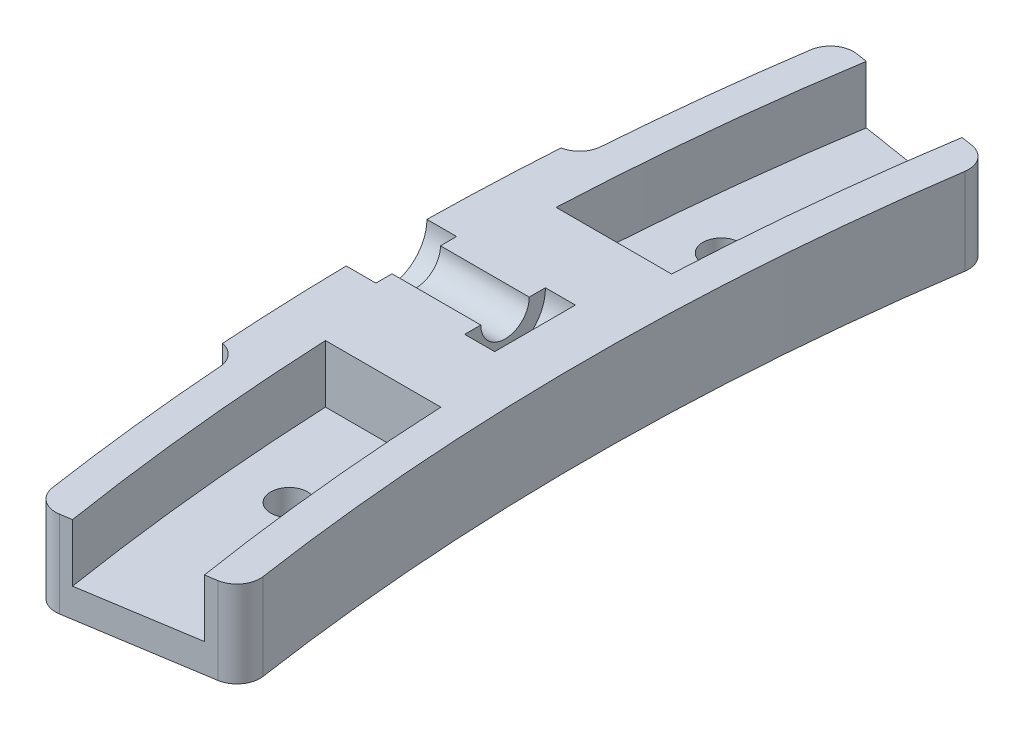
ISO-10303-21;
HEADER;
FILE_DESCRIPTION(('STEP AP214'),'2;1');
FILE_NAME('part.step','',(''),(''),'','','');
FILE_SCHEMA(('AUTOMOTIVE_DESIGN { 1 0 10303 214 1 1 1 1 }'));
ENDSEC;
DATA;
#1=APPLICATION_CONTEXT('core data for automotive mechanical design processes');
#2=APPLICATION_PROTOCOL_DEFINITION('international standard','automotive_design',2000,#1);
#3=PRODUCT_CONTEXT('',#1,'mechanical');
#4=PRODUCT('Part','Part','',(#3));
#5=PRODUCT_RELATED_PRODUCT_CATEGORY('part','',(#4));
#6=PRODUCT_DEFINITION_FORMATION('','',#4);
#7=PRODUCT_DEFINITION_CONTEXT('part definition',#1,'design');
#8=PRODUCT_DEFINITION('design','',#6,#7);
#9=PRODUCT_DEFINITION_SHAPE('','',#8);
#10=(LENGTH_UNIT() NAMED_UNIT(*) SI_UNIT(.MILLI.,.METRE.));
#11=(NAMED_UNIT(*) PLANE_ANGLE_UNIT() SI_UNIT($,.RADIAN.));
#12=(NAMED_UNIT(*) SI_UNIT($,.STERADIAN.) SOLID_ANGLE_UNIT());
#13=UNCERTAINTY_MEASURE_WITH_UNIT(LENGTH_MEASURE(1.E-05),#10,'distance_accuracy_value','');
#14=(GEOMETRIC_REPRESENTATION_CONTEXT(3) GLOBAL_UNCERTAINTY_ASSIGNED_CONTEXT((#13)) GLOBAL_UNIT_ASSIGNED_CONTEXT((#10,
#11,#12)) REPRESENTATION_CONTEXT('',''));
#15=CARTESIAN_POINT('',(0.,0.,0.));
#16=DIRECTION('',(0.,0.,1.));
#17=DIRECTION('',(1.,0.,0.));
#18=AXIS2_PLACEMENT_3D('',#15,#16,#17);
#19=CARTESIAN_POINT('',(0.,7.5,0.));
#20=DIRECTION('',(0.,1.,0.));
#21=DIRECTION('',(0.,0.,1.));
#22=AXIS2_PLACEMENT_3D('',#19,#20,#21);
#23=PLANE('',#22);
#24=CARTESIAN_POINT('',(0.,7.5,0.));
#25=DIRECTION('',(0.,1.,0.));
#26=DIRECTION('',(0.,0.,1.));
#27=AXIS2_PLACEMENT_3D('',#24,#25,#26);
#28=CIRCLE('',#27,224.5);
#29=CARTESIAN_POINT('',(-224.019328267066,7.5,-14.6830025121671));
#30=VERTEX_POINT('',#29);
#31=CARTESIAN_POINT('',(-224.472715491215,7.5,-3.5));
#32=VERTEX_POINT('',#31);
#33=EDGE_CURVE('E319',#30,#32,#28,.T.);
#34=ORIENTED_EDGE('',*,*,#33,.T.);
#35=DIRECTION('',(-1.,0.,0.));
#36=VECTOR('',#35,1.);
#37=CARTESIAN_POINT('',(-224.5,7.5,-3.5));
#38=LINE('',#37,#36);
#39=CARTESIAN_POINT('',(-221.9,7.5,-3.5));
#40=VERTEX_POINT('',#39);
#41=EDGE_CURVE('E222',#32,#40,#38,.F.);
#42=ORIENTED_EDGE('',*,*,#41,.T.);
#43=DIRECTION('',(0.,0.,1.));
#44=VECTOR('',#43,1.);
#45=CARTESIAN_POINT('',(-221.9,7.5,0.));
#46=LINE('',#45,#44);
#47=CARTESIAN_POINT('',(-221.9,7.5,-2.10000000000001));
#48=VERTEX_POINT('',#47);
#49=EDGE_CURVE('E223',#40,#48,#46,.T.);
#50=ORIENTED_EDGE('',*,*,#49,.T.);
#51=DIRECTION('',(1.,0.,0.));
#52=VECTOR('',#51,1.);
#53=CARTESIAN_POINT('',(-224.5,7.5,-2.10000000000001));
#54=LINE('',#53,#52);
#55=CARTESIAN_POINT('',(-214.200000000001,7.5,-2.10000000000001));
#56=VERTEX_POINT('',#55);
#57=EDGE_CURVE('E244',#56,#48,#54,.F.);
#58=ORIENTED_EDGE('',*,*,#57,.F.);
#59=DIRECTION('',(0.,0.,1.));
#60=VECTOR('',#59,1.);
#61=CARTESIAN_POINT('',(-214.2,7.5,5.26399215997816E-12));
#62=LINE('',#61,#60);
#63=CARTESIAN_POINT('',(-214.200000000001,7.5,-3.49947186729268));
#64=VERTEX_POINT('',#63);
#65=EDGE_CURVE('E243',#64,#56,#62,.T.);
#66=ORIENTED_EDGE('',*,*,#65,.F.);
#67=DIRECTION('',(1.,0.,0.));
#68=VECTOR('',#67,1.);
#69=CARTESIAN_POINT('',(-214.200000000001,7.5,-3.49947186729268));
#70=LINE('',#69,#68);
#71=CARTESIAN_POINT('',(-211.600000000001,7.5,-3.49947186729274));
#72=VERTEX_POINT('',#71);
#73=EDGE_CURVE('E414',#64,#72,#70,.T.);
#74=ORIENTED_EDGE('',*,*,#73,.T.);
#75=DIRECTION('',(0.,0.,1.));
#76=VECTOR('',#75,1.);
#77=CARTESIAN_POINT('',(-211.6,7.5,5.20009683030522E-12));
#78=LINE('',#77,#76);
#79=CARTESIAN_POINT('',(-211.6,7.5,3.49947186730315));
#80=VERTEX_POINT('',#79);
#81=EDGE_CURVE('E406',#72,#80,#78,.T.);
#82=ORIENTED_EDGE('',*,*,#81,.T.);
#83=DIRECTION('',(1.,0.,0.));
#84=VECTOR('',#83,1.);
#85=CARTESIAN_POINT('',(-214.2,7.5,3.49947186730321));
#86=LINE('',#85,#84);
#87=CARTESIAN_POINT('',(-214.2,7.5,3.49947186730321));
#88=VERTEX_POINT('',#87);
#89=EDGE_CURVE('E411',#80,#88,#86,.F.);
#90=ORIENTED_EDGE('',*,*,#89,.T.);
#91=CARTESIAN_POINT('',(-214.2,7.5,2.09999999999999));
#92=VERTEX_POINT('',#91);
#93=EDGE_CURVE('E239',#92,#88,#62,.T.);
#94=ORIENTED_EDGE('',*,*,#93,.F.);
#95=DIRECTION('',(1.,0.,0.));
#96=VECTOR('',#95,1.);
#97=CARTESIAN_POINT('',(-224.5,7.5,2.09999999999999));
#98=LINE('',#97,#96);
#99=CARTESIAN_POINT('',(-221.9,7.5,2.09999999999999));
#100=VERTEX_POINT('',#99);
#101=EDGE_CURVE('E231',#100,#92,#98,.T.);
#102=ORIENTED_EDGE('',*,*,#101,.F.);
#103=CARTESIAN_POINT('',(-221.9,7.5,3.49999999999995));
#104=VERTEX_POINT('',#103);
#105=EDGE_CURVE('E58',#100,#104,#46,.T.);
#106=ORIENTED_EDGE('',*,*,#105,.T.);
#107=DIRECTION('',(-1.,0.,0.));
#108=VECTOR('',#107,1.);
#109=CARTESIAN_POINT('',(-224.5,7.5,3.49999999999995));
#110=LINE('',#109,#108);
#111=CARTESIAN_POINT('',(-224.472715491215,7.5,3.49999999999995));
#112=VERTEX_POINT('',#111);
#113=EDGE_CURVE('E216',#104,#112,#110,.T.);
#114=ORIENTED_EDGE('',*,*,#113,.T.);
#115=CARTESIAN_POINT('',(-224.019328267066,7.5,14.6830025121672));
#116=VERTEX_POINT('',#115);
#117=EDGE_CURVE('E322',#112,#116,#28,.T.);
#118=ORIENTED_EDGE('',*,*,#117,.T.);
#119=CARTESIAN_POINT('',(-224.383131319015,7.5,16.6496360162551));
#120=DIRECTION('',(0.,1.,0.));
#121=DIRECTION('',(0.,0.,1.));
#122=AXIS2_PLACEMENT_3D('',#119,#120,#121);
#123=CIRCLE('',#122,2.);
#124=CARTESIAN_POINT('',(-222.388614596179,7.5,16.5016392516661));
#125=VERTEX_POINT('',#124);
#126=EDGE_CURVE('E66',#116,#125,#123,.F.);
#127=ORIENTED_EDGE('',*,*,#126,.T.);
#128=CARTESIAN_POINT('',(0.,7.5,0.));
#129=DIRECTION('',(0.,1.,0.));
#130=DIRECTION('',(0.,0.,1.));
#131=AXIS2_PLACEMENT_3D('',#128,#129,#130);
#132=CIRCLE('',#131,223.);
#133=CARTESIAN_POINT('',(-220.561180845032,7.5,32.8902037732362));
#134=VERTEX_POINT('',#133);
#135=EDGE_CURVE('E340',#125,#134,#132,.T.);
#136=ORIENTED_EDGE('',*,*,#135,.T.);
#137=CARTESIAN_POINT('',(-218.583053662566,7.5,32.5952243671982));
#138=DIRECTION('',(0.,1.,0.));
#139=DIRECTION('',(0.,0.,1.));
#140=AXIS2_PLACEMENT_3D('',#137,#138,#139);
#141=CIRCLE('',#140,2.);
#142=CARTESIAN_POINT('',(-218.270184732485,7.5,34.5706010483885));
#143=VERTEX_POINT('',#142);
#144=EDGE_CURVE('E373',#134,#143,#141,.T.);
#145=ORIENTED_EDGE('',*,*,#144,.T.);
#146=DIRECTION('',(-0.987688340595137,0.,0.156434465040234));
#147=VECTOR('',#146,1.);
#148=CARTESIAN_POINT('',(0.,7.5,0.));
#149=LINE('',#148,#147);
#150=CARTESIAN_POINT('',(-217.29143493093,7.5,34.4155823088514));
#151=VERTEX_POINT('',#150);
#152=EDGE_CURVE('E334',#151,#143,#149,.T.);
#153=ORIENTED_EDGE('',*,*,#152,.F.);
#154=CARTESIAN_POINT('',(0.,7.5,0.));
#155=DIRECTION('',(0.,1.,0.));
#156=DIRECTION('',(0.,0.,1.));
#157=AXIS2_PLACEMENT_3D('',#154,#155,#156);
#158=CIRCLE('',#157,220.);
#159=CARTESIAN_POINT('',(-219.772609758359,7.5,10.));
#160=VERTEX_POINT('',#159);
#161=EDGE_CURVE('E306',#160,#151,#158,.T.);
#162=ORIENTED_EDGE('',*,*,#161,.F.);
#163=DIRECTION('',(-1.,0.,0.));
#164=VECTOR('',#163,1.);
#165=CARTESIAN_POINT('',(0.,7.5,10.));
#166=LINE('',#165,#164);
#167=CARTESIAN_POINT('',(-209.76176963403,7.5,10.));
#168=VERTEX_POINT('',#167);
#169=EDGE_CURVE('E260',#168,#160,#166,.T.);
#170=ORIENTED_EDGE('',*,*,#169,.F.);
#171=CARTESIAN_POINT('',(0.,7.5,0.));
#172=DIRECTION('',(0.,1.,0.));
#173=DIRECTION('',(0.,0.,1.));
#174=AXIS2_PLACEMENT_3D('',#171,#172,#173);
#175=CIRCLE('',#174,210.);
#176=CARTESIAN_POINT('',(-207.414551524979,7.5,32.8512376584491));
#177=VERTEX_POINT('',#176);
#178=EDGE_CURVE('E296',#168,#177,#175,.T.);
#179=ORIENTED_EDGE('',*,*,#178,.T.);
#180=CARTESIAN_POINT('',(-206.417411404929,7.5,32.6933061786099));
#181=VERTEX_POINT('',#180);
#182=EDGE_CURVE('E331',#181,#177,#149,.T.);
#183=ORIENTED_EDGE('',*,*,#182,.F.);
#184=CARTESIAN_POINT('',(-206.730280335009,7.5,30.7179294974196));
#185=DIRECTION('',(0.,1.,0.));
#186=DIRECTION('',(0.,0.,1.));
#187=AXIS2_PLACEMENT_3D('',#184,#185,#186);
#188=CIRCLE('',#187,2.);
#189=CARTESIAN_POINT('',(-204.752000140416,7.5,30.4239780189754));
#190=VERTEX_POINT('',#189);
#191=EDGE_CURVE('E375',#181,#190,#188,.T.);
#192=ORIENTED_EDGE('',*,*,#191,.T.);
#193=CARTESIAN_POINT('',(0.,7.5,0.));
#194=DIRECTION('',(0.,1.,0.));
#195=DIRECTION('',(0.,0.,1.));
#196=AXIS2_PLACEMENT_3D('',#193,#194,#195);
#197=CIRCLE('',#196,207.);
#198=CARTESIAN_POINT('',(-204.752000140416,7.5,-30.4239780189754));
#199=VERTEX_POINT('',#198);
#200=EDGE_CURVE('E333',#199,#190,#197,.T.);
#201=ORIENTED_EDGE('',*,*,#200,.F.);
#202=CARTESIAN_POINT('',(-206.730280335009,7.5,-30.7179294974196));
#203=DIRECTION('',(0.,1.,0.));
#204=DIRECTION('',(0.,0.,1.));
#205=AXIS2_PLACEMENT_3D('',#202,#203,#204);
#206=CIRCLE('',#205,2.);
#207=CARTESIAN_POINT('',(-206.417411404929,7.5,-32.6933061786099));
#208=VERTEX_POINT('',#207);
#209=EDGE_CURVE('E377',#199,#208,#206,.T.);
#210=ORIENTED_EDGE('',*,*,#209,.T.);
#211=DIRECTION('',(0.987688340595137,0.,0.156434465040234));
#212=VECTOR('',#211,1.);
#213=CARTESIAN_POINT('',(0.,7.5,0.));
#214=LINE('',#213,#212);
#215=CARTESIAN_POINT('',(-207.414551524979,7.5,-32.8512376584492));
#216=VERTEX_POINT('',#215);
#217=EDGE_CURVE('E337',#216,#208,#214,.T.);
#218=ORIENTED_EDGE('',*,*,#217,.F.);
#219=CARTESIAN_POINT('',(0.,7.5,0.));
#220=DIRECTION('',(0.,1.,0.));
#221=DIRECTION('',(0.,0.,1.));
#222=AXIS2_PLACEMENT_3D('',#219,#220,#221);
#223=CIRCLE('',#222,210.);
#224=CARTESIAN_POINT('',(-209.76176963403,7.5,-9.99999999999998));
#225=VERTEX_POINT('',#224);
#226=EDGE_CURVE('E265',#216,#225,#223,.T.);
#227=ORIENTED_EDGE('',*,*,#226,.T.);
#228=DIRECTION('',(-1.,0.,0.));
#229=VECTOR('',#228,1.);
#230=CARTESIAN_POINT('',(0.,7.5,-10.));
#231=LINE('',#230,#229);
#232=CARTESIAN_POINT('',(-219.772609758359,7.5,-9.99999999999997));
#233=VERTEX_POINT('',#232);
#234=EDGE_CURVE('E276',#225,#233,#231,.T.);
#235=ORIENTED_EDGE('',*,*,#234,.T.);
#236=CARTESIAN_POINT('',(0.,7.5,0.));
#237=DIRECTION('',(0.,1.,0.));
#238=DIRECTION('',(0.,0.,1.));
#239=AXIS2_PLACEMENT_3D('',#236,#237,#238);
#240=CIRCLE('',#239,220.);
#241=CARTESIAN_POINT('',(-217.29143493093,7.5,-34.4155823088514));
#242=VERTEX_POINT('',#241);
#243=EDGE_CURVE('E273',#242,#233,#240,.T.);
#244=ORIENTED_EDGE('',*,*,#243,.F.);
#245=CARTESIAN_POINT('',(-218.270184732485,7.5,-34.5706010483885));
#246=VERTEX_POINT('',#245);
#247=EDGE_CURVE('E338',#246,#242,#214,.T.);
#248=ORIENTED_EDGE('',*,*,#247,.F.);
#249=CARTESIAN_POINT('',(-218.583053662566,7.5,-32.5952243671982));
#250=DIRECTION('',(0.,1.,0.));
#251=DIRECTION('',(0.,0.,1.));
#252=AXIS2_PLACEMENT_3D('',#249,#250,#251);
#253=CIRCLE('',#252,2.);
#254=CARTESIAN_POINT('',(-220.561180845032,7.5,-32.8902037732362));
#255=VERTEX_POINT('',#254);
#256=EDGE_CURVE('E379',#246,#255,#253,.T.);
#257=ORIENTED_EDGE('',*,*,#256,.T.);
#258=CARTESIAN_POINT('',(-222.388614596179,7.5,-16.5016392516641));
#259=VERTEX_POINT('',#258);
#260=EDGE_CURVE('E341',#255,#259,#132,.T.);
#261=ORIENTED_EDGE('',*,*,#260,.T.);
#262=CARTESIAN_POINT('',(-224.383131319015,7.5,-16.649636016253));
#263=DIRECTION('',(0.,1.,0.));
#264=DIRECTION('',(0.,0.,1.));
#265=AXIS2_PLACEMENT_3D('',#262,#263,#264);
#266=CIRCLE('',#265,2.);
#267=EDGE_CURVE('E401',#259,#30,#266,.F.);
#268=ORIENTED_EDGE('',*,*,#267,.T.);
#269=EDGE_LOOP('',(#34,#42,#50,#58,#66,#74,#82,#90,#94,#102,#106,#114,#118,#127,#136,#145,#153,
#162,#170,#179,#183,#192,#201,#210,#218,#227,#235,#244,#248,#257,#261,#268));
#270=FACE_BOUND('',#269,.T.);
#271=ADVANCED_FACE('F37',(#270),#23,.T.);
#272=CARTESIAN_POINT('',(0.,7.5,0.));
#273=DIRECTION('',(0.,-1.,0.));
#274=DIRECTION('',(0.,0.,-1.));
#275=AXIS2_PLACEMENT_3D('',#272,#273,#274);
#276=CYLINDRICAL_SURFACE('',#275,224.5);
#277=CARTESIAN_POINT('',(-224.472715491215,7.5,-3.5));
#278=CARTESIAN_POINT('',(-224.472714861712,7.40156578840338,-3.50000943737716));
#279=CARTESIAN_POINT('',(-224.472780225117,7.30313605810773,-3.49584747938354));
#280=CARTESIAN_POINT('',(-224.473038289765,7.1069809173122,-3.47925381156051));
#281=CARTESIAN_POINT('',(-224.473230984854,7.00925547300403,-3.46682250139931));
#282=CARTESIAN_POINT('',(-224.473738885951,6.8152632798036,-3.43377485265587));
#283=CARTESIAN_POINT('',(-224.474054005164,6.71899554756869,-3.41316431264958));
#284=CARTESIAN_POINT('',(-224.474797261434,6.52856227230528,-3.36392550562658));
#285=CARTESIAN_POINT('',(-224.475225397129,6.43439670394645,-3.33529733527587));
#286=CARTESIAN_POINT('',(-224.476662783917,6.15596524404037,-3.23761897666636));
#287=CARTESIAN_POINT('',(-224.477825245954,5.97568200368354,-3.15676079513716));
#288=CARTESIAN_POINT('',(-224.480426703749,5.63138518923722,-2.96598425473683));
#289=CARTESIAN_POINT('',(-224.48186564567,5.46736845712206,-2.85607155183975));
#290=CARTESIAN_POINT('',(-224.484858395544,5.16006978767687,-2.61025296217331));
#291=CARTESIAN_POINT('',(-224.486412214712,5.01678987859334,-2.47434453580414));
#292=CARTESIAN_POINT('',(-224.489459632982,4.75506499986371,-2.18038409126836));
#293=CARTESIAN_POINT('',(-224.490953222877,4.63662381547568,-2.02232870416418));
#294=CARTESIAN_POINT('',(-224.493711562528,4.42795602564903,-1.68857247177381));
#295=CARTESIAN_POINT('',(-224.494976310728,4.33772961211474,-1.51287150648099));
#296=CARTESIAN_POINT('',(-224.497134279755,4.18806213664848,-1.14882485480166));
#297=CARTESIAN_POINT('',(-224.498027524533,4.12861909003653,-0.960479984483705));
#298=CARTESIAN_POINT('',(-224.499341856259,4.04220007556948,-0.576494033295444));
#299=CARTESIAN_POINT('',(-224.499762972449,4.01522209692809,-0.380853405075797));
#300=CARTESIAN_POINT('',(-224.500085673098,3.99449295010015,0.0121851581695343));
#301=CARTESIAN_POINT('',(-224.499987245918,4.00074252625487,0.209583132463209));
#302=CARTESIAN_POINT('',(-224.499281965034,4.04629033944203,0.600508238712191));
#303=CARTESIAN_POINT('',(-224.498675160583,4.08558537482803,0.794035743802673));
#304=CARTESIAN_POINT('',(-224.497021592075,4.1961036468751,1.17174593250207));
#305=CARTESIAN_POINT('',(-224.495974829285,4.2673267915241,1.35592864303959));
#306=CARTESIAN_POINT('',(-224.493559239443,4.43968478895615,1.70973551861152));
#307=CARTESIAN_POINT('',(-224.492190389736,4.54082174598735,1.87935865838854));
#308=CARTESIAN_POINT('',(-224.489285031404,4.77012988756459,2.19921078253235));
#309=CARTESIAN_POINT('',(-224.487748530898,4.89829976292092,2.34944070553442));
#310=CARTESIAN_POINT('',(-224.484681028317,5.17803246732865,2.62624976845429));
#311=CARTESIAN_POINT('',(-224.483150026089,5.32959464646475,2.75282956523463));
#312=CARTESIAN_POINT('',(-224.480265583076,5.65187883091554,2.97878840736272));
#313=CARTESIAN_POINT('',(-224.478912198826,5.82260690456416,3.07815880318588));
#314=CARTESIAN_POINT('',(-224.476535449462,6.17839774925335,3.24687297259607));
#315=CARTESIAN_POINT('',(-224.475512286168,6.36346920112557,3.31619839255343));
#316=CARTESIAN_POINT('',(-224.473914065314,6.74248187923013,3.4226871967959));
#317=CARTESIAN_POINT('',(-224.473338323597,6.93640908134263,3.45989969487161));
#318=CARTESIAN_POINT('',(-224.472916934368,7.19302192271803,3.48705818759328));
#319=CARTESIAN_POINT('',(-224.472841431698,7.25437105769747,3.49191392810576));
#320=CARTESIAN_POINT('',(-224.472740777511,7.37713851009347,3.49838040408815));
#321=CARTESIAN_POINT('',(-224.472715542936,7.4385565453343,3.49999649249394));
#322=CARTESIAN_POINT('',(-224.472715491215,7.5,3.49999999999995));
#323=B_SPLINE_CURVE_WITH_KNOTS('',3,(#277,#278,#279,#280,#281,#282,#283,#284,#285,#286,#287,
#288,#289,#290,#291,#292,#293,#294,#295,#296,#297,#298,#299,#300,#301,#302,#303,#304,#305,#306,
#307,#308,#309,#310,#311,#312,#313,#314,#315,#316,#317,#318,#319,#320,#321,#322),.UNSPECIFIED.,
.F.,.F.,(4,2,2,2,2,2,2,2,2,2,2,2,2,2,2,2,2,2,2,2,2,2,4),(0.,0.29520657625106,0.590398885833,
0.885382294826047,1.18036214745175,1.77007362886811,2.35967039699536,2.94932479403663,
3.53906898533124,4.12881718771663,4.71852736283831,5.30820101124837,5.89788786918531,
6.48751760122972,7.07714563405961,7.6668151533735,8.25645612186404,8.84608071113289,
9.43589251757687,10.0260641173299,10.6153314954947,10.7998949857025,10.9841532661159),.UNSPECIFIED.);
#324=EDGE_CURVE('E11',#32,#112,#323,.T.);
#325=ORIENTED_EDGE('',*,*,#324,.F.);
#326=ORIENTED_EDGE('',*,*,#33,.F.);
#327=DIRECTION('',(0.,-1.,0.));
#328=VECTOR('',#327,1.);
#329=CARTESIAN_POINT('',(-224.019328267066,7.5,-14.6830025121671));
#330=LINE('',#329,#328);
#331=CARTESIAN_POINT('',(-224.019328267066,0.,-14.6830025121671));
#332=VERTEX_POINT('',#331);
#333=EDGE_CURVE('E321',#30,#332,#330,.T.);
#334=ORIENTED_EDGE('',*,*,#333,.T.);
#335=CARTESIAN_POINT('',(0.,0.,0.));
#336=DIRECTION('',(0.,1.,0.));
#337=DIRECTION('',(0.,0.,1.));
#338=AXIS2_PLACEMENT_3D('',#335,#336,#337);
#339=CIRCLE('',#338,224.5);
#340=CARTESIAN_POINT('',(-224.019328267066,0.,14.6830025121672));
#341=VERTEX_POINT('',#340);
#342=EDGE_CURVE('E285',#332,#341,#339,.T.);
#343=ORIENTED_EDGE('',*,*,#342,.T.);
#344=DIRECTION('',(0.,-1.,0.));
#345=VECTOR('',#344,1.);
#346=CARTESIAN_POINT('',(-224.019328267066,7.5,14.6830025121672));
#347=LINE('',#346,#345);
#348=EDGE_CURVE('E327',#116,#341,#347,.T.);
#349=ORIENTED_EDGE('',*,*,#348,.F.);
#350=ORIENTED_EDGE('',*,*,#117,.F.);
#351=EDGE_LOOP('',(#325,#326,#334,#343,#349,#350));
#352=FACE_BOUND('',#351,.T.);
#353=ADVANCED_FACE('F441',(#352),#276,.T.);
#354=CARTESIAN_POINT('',(-224.5,7.5,0.));
#355=DIRECTION('',(1.,0.,0.));
#356=DIRECTION('',(0.,0.,-1.));
#357=AXIS2_PLACEMENT_3D('',#354,#355,#356);
#358=CYLINDRICAL_SURFACE('',#357,2.1);
#359=CARTESIAN_POINT('',(-221.9,7.5,0.));
#360=DIRECTION('',(-1.,0.,0.));
#361=DIRECTION('',(0.,0.,1.));
#362=AXIS2_PLACEMENT_3D('',#359,#360,#361);
#363=CIRCLE('',#362,2.1);
#364=EDGE_CURVE('E51',#100,#48,#363,.F.);
#365=ORIENTED_EDGE('',*,*,#364,.F.);
#366=ORIENTED_EDGE('',*,*,#101,.T.);
#367=CARTESIAN_POINT('',(-214.2,7.5,0.));
#368=DIRECTION('',(-1.,0.,0.));
#369=DIRECTION('',(0.,0.,1.));
#370=AXIS2_PLACEMENT_3D('',#367,#368,#369);
#371=CIRCLE('',#370,2.1);
#372=EDGE_CURVE('E408',#92,#56,#371,.F.);
#373=ORIENTED_EDGE('',*,*,#372,.T.);
#374=ORIENTED_EDGE('',*,*,#57,.T.);
#375=EDGE_LOOP('',(#365,#366,#373,#374));
#376=FACE_BOUND('',#375,.T.);
#377=ADVANCED_FACE('F419',(#376),#358,.F.);
#378=CARTESIAN_POINT('',(0.,7.5,0.));
#379=DIRECTION('',(0.156434465040234,0.,0.987688340595137));
#380=DIRECTION('',(0.987688340595137,0.,-0.156434465040234));
#381=AXIS2_PLACEMENT_3D('',#378,#379,#380);
#382=PLANE('',#381);
#383=DIRECTION('',(-0.987688340595137,0.,0.156434465040234));
#384=VECTOR('',#383,1.);
#385=CARTESIAN_POINT('',(0.,0.,0.));
#386=LINE('',#385,#384);
#387=CARTESIAN_POINT('',(-206.417411404929,0.,32.6933061786099));
#388=VERTEX_POINT('',#387);
#389=CARTESIAN_POINT('',(-218.270184732485,0.,34.5706010483885));
#390=VERTEX_POINT('',#389);
#391=EDGE_CURVE('E330',#388,#390,#386,.T.);
#392=ORIENTED_EDGE('',*,*,#391,.F.);
#393=DIRECTION('',(0.,-1.,0.));
#394=VECTOR('',#393,1.);
#395=CARTESIAN_POINT('',(-206.417411404929,7.5,32.6933061786099));
#396=LINE('',#395,#394);
#397=EDGE_CURVE('E389',#388,#181,#396,.F.);
#398=ORIENTED_EDGE('',*,*,#397,.T.);
#399=ORIENTED_EDGE('',*,*,#182,.T.);
#400=DIRECTION('',(0.,1.,0.));
#401=VECTOR('',#400,1.);
#402=CARTESIAN_POINT('',(-207.414551524979,2.5,32.8512376584491));
#403=LINE('',#402,#401);
#404=CARTESIAN_POINT('',(-207.414551524979,2.5,32.8512376584491));
#405=VERTEX_POINT('',#404);
#406=EDGE_CURVE('E311',#405,#177,#403,.T.);
#407=ORIENTED_EDGE('',*,*,#406,.F.);
#408=DIRECTION('',(0.987688340595137,0.,-0.156434465040234));
#409=VECTOR('',#408,1.);
#410=CARTESIAN_POINT('',(0.,2.5,0.));
#411=LINE('',#410,#409);
#412=CARTESIAN_POINT('',(-217.29143493093,2.5,34.4155823088514));
#413=VERTEX_POINT('',#412);
#414=EDGE_CURVE('E299',#413,#405,#411,.T.);
#415=ORIENTED_EDGE('',*,*,#414,.F.);
#416=DIRECTION('',(0.,1.,0.));
#417=VECTOR('',#416,1.);
#418=CARTESIAN_POINT('',(-217.29143493093,2.5,34.4155823088514));
#419=LINE('',#418,#417);
#420=EDGE_CURVE('E314',#413,#151,#419,.T.);
#421=ORIENTED_EDGE('',*,*,#420,.T.);
#422=ORIENTED_EDGE('',*,*,#152,.T.);
#423=DIRECTION('',(0.,1.,0.));
#424=VECTOR('',#423,1.);
#425=CARTESIAN_POINT('',(-218.270184732485,0.,34.5706010483885));
#426=LINE('',#425,#424);
#427=EDGE_CURVE('E386',#143,#390,#426,.F.);
#428=ORIENTED_EDGE('',*,*,#427,.T.);
#429=EDGE_LOOP('',(#392,#398,#399,#407,#415,#421,#422,#428));
#430=FACE_BOUND('',#429,.T.);
#431=ADVANCED_FACE('F464',(#430),#382,.T.);
#432=CARTESIAN_POINT('',(0.,7.5,0.));
#433=DIRECTION('',(0.156434465040234,0.,-0.987688340595137));
#434=DIRECTION('',(-0.987688340595137,0.,-0.156434465040234));
#435=AXIS2_PLACEMENT_3D('',#432,#433,#434);
#436=PLANE('',#435);
#437=DIRECTION('',(0.987688340595137,0.,0.156434465040234));
#438=VECTOR('',#437,1.);
#439=CARTESIAN_POINT('',(0.,0.,0.));
#440=LINE('',#439,#438);
#441=CARTESIAN_POINT('',(-218.270184732485,0.,-34.5706010483885));
#442=VERTEX_POINT('',#441);
#443=CARTESIAN_POINT('',(-206.417411404929,0.,-32.6933061786099));
#444=VERTEX_POINT('',#443);
#445=EDGE_CURVE('E350',#442,#444,#440,.T.);
#446=ORIENTED_EDGE('',*,*,#445,.F.);
#447=DIRECTION('',(0.,1.,0.));
#448=VECTOR('',#447,1.);
#449=CARTESIAN_POINT('',(-218.270184732485,7.5,-34.5706010483885));
#450=LINE('',#449,#448);
#451=EDGE_CURVE('E371',#442,#246,#450,.T.);
#452=ORIENTED_EDGE('',*,*,#451,.T.);
#453=ORIENTED_EDGE('',*,*,#247,.T.);
#454=DIRECTION('',(0.,1.,0.));
#455=VECTOR('',#454,1.);
#456=CARTESIAN_POINT('',(-217.291434930931,2.5,-34.4155823088515));
#457=LINE('',#456,#455);
#458=CARTESIAN_POINT('',(-217.291434930931,2.5,-34.4155823088515));
#459=VERTEX_POINT('',#458);
#460=EDGE_CURVE('E272',#459,#242,#457,.T.);
#461=ORIENTED_EDGE('',*,*,#460,.F.);
#462=DIRECTION('',(-0.987688340595137,0.,-0.156434465040234));
#463=VECTOR('',#462,1.);
#464=CARTESIAN_POINT('',(0.,2.5,0.));
#465=LINE('',#464,#463);
#466=CARTESIAN_POINT('',(-207.414551524979,2.5,-32.8512376584492));
#467=VERTEX_POINT('',#466);
#468=EDGE_CURVE('E261',#467,#459,#465,.T.);
#469=ORIENTED_EDGE('',*,*,#468,.F.);
#470=DIRECTION('',(0.,1.,0.));
#471=VECTOR('',#470,1.);
#472=CARTESIAN_POINT('',(-207.414551524979,2.5,-32.8512376584492));
#473=LINE('',#472,#471);
#474=EDGE_CURVE('E282',#467,#216,#473,.T.);
#475=ORIENTED_EDGE('',*,*,#474,.T.);
#476=ORIENTED_EDGE('',*,*,#217,.T.);
#477=DIRECTION('',(0.,-1.,0.));
#478=VECTOR('',#477,1.);
#479=CARTESIAN_POINT('',(-206.417411404929,7.5,-32.6933061786099));
#480=LINE('',#479,#478);
#481=EDGE_CURVE('E368',#208,#444,#480,.T.);
#482=ORIENTED_EDGE('',*,*,#481,.T.);
#483=EDGE_LOOP('',(#446,#452,#453,#461,#469,#475,#476,#482));
#484=FACE_BOUND('',#483,.T.);
#485=ADVANCED_FACE('F460',(#484),#436,.T.);
#486=CARTESIAN_POINT('',(0.,7.5,0.));
#487=DIRECTION('',(0.,-1.,0.));
#488=DIRECTION('',(0.,0.,-1.));
#489=AXIS2_PLACEMENT_3D('',#486,#487,#488);
#490=CYLINDRICAL_SURFACE('',#489,223.);
#491=ORIENTED_EDGE('',*,*,#135,.F.);
#492=DIRECTION('',(0.,-1.,0.));
#493=VECTOR('',#492,1.);
#494=CARTESIAN_POINT('',(-222.388614596179,7.5,16.5016392516661));
#495=LINE('',#494,#493);
#496=CARTESIAN_POINT('',(-222.388614596179,0.,16.5016392516661));
#497=VERTEX_POINT('',#496);
#498=EDGE_CURVE('E396',#125,#497,#495,.T.);
#499=ORIENTED_EDGE('',*,*,#498,.T.);
#500=CARTESIAN_POINT('',(0.,0.,0.));
#501=DIRECTION('',(0.,1.,0.));
#502=DIRECTION('',(0.,0.,1.));
#503=AXIS2_PLACEMENT_3D('',#500,#501,#502);
#504=CIRCLE('',#503,223.);
#505=CARTESIAN_POINT('',(-220.561180845032,0.,32.8902037732362));
#506=VERTEX_POINT('',#505);
#507=EDGE_CURVE('E353',#497,#506,#504,.T.);
#508=ORIENTED_EDGE('',*,*,#507,.T.);
#509=DIRECTION('',(0.,-1.,0.));
#510=VECTOR('',#509,1.);
#511=CARTESIAN_POINT('',(-220.561180845032,7.5,32.8902037732362));
#512=LINE('',#511,#510);
#513=EDGE_CURVE('E391',#506,#134,#512,.F.);
#514=ORIENTED_EDGE('',*,*,#513,.T.);
#515=EDGE_LOOP('',(#491,#499,#508,#514));
#516=FACE_BOUND('',#515,.T.);
#517=ADVANCED_FACE('F456',(#516),#490,.T.);
#518=CARTESIAN_POINT('',(-220.561180845032,0.,-32.8902037732362));
#519=VERTEX_POINT('',#518);
#520=CARTESIAN_POINT('',(-222.388614596179,0.,-16.5016392516641));
#521=VERTEX_POINT('',#520);
#522=EDGE_CURVE('E354',#519,#521,#504,.T.);
#523=ORIENTED_EDGE('',*,*,#522,.T.);
#524=DIRECTION('',(0.,-1.,0.));
#525=VECTOR('',#524,1.);
#526=CARTESIAN_POINT('',(-222.388614596179,7.5,-16.5016392516641));
#527=LINE('',#526,#525);
#528=EDGE_CURVE('E394',#521,#259,#527,.F.);
#529=ORIENTED_EDGE('',*,*,#528,.T.);
#530=ORIENTED_EDGE('',*,*,#260,.F.);
#531=DIRECTION('',(0.,-1.,0.));
#532=VECTOR('',#531,1.);
#533=CARTESIAN_POINT('',(-220.561180845032,7.5,-32.8902037732362));
#534=LINE('',#533,#532);
#535=EDGE_CURVE('E344',#255,#519,#534,.T.);
#536=ORIENTED_EDGE('',*,*,#535,.T.);
#537=EDGE_LOOP('',(#523,#529,#530,#536));
#538=FACE_BOUND('',#537,.T.);
#539=ADVANCED_FACE('F459',(#538),#490,.T.);
#540=CARTESIAN_POINT('',(0.,7.5,0.));
#541=DIRECTION('',(0.,-1.,0.));
#542=DIRECTION('',(0.,0.,-1.));
#543=AXIS2_PLACEMENT_3D('',#540,#541,#542);
#544=CYLINDRICAL_SURFACE('',#543,207.);
#545=CARTESIAN_POINT('',(0.,0.,0.));
#546=DIRECTION('',(0.,1.,0.));
#547=DIRECTION('',(0.,0.,1.));
#548=AXIS2_PLACEMENT_3D('',#545,#546,#547);
#549=CIRCLE('',#548,207.);
#550=CARTESIAN_POINT('',(-204.752000140416,0.,-30.4239780189754));
#551=VERTEX_POINT('',#550);
#552=CARTESIAN_POINT('',(-204.752000140416,0.,30.4239780189754));
#553=VERTEX_POINT('',#552);
#554=EDGE_CURVE('E347',#551,#553,#549,.T.);
#555=ORIENTED_EDGE('',*,*,#554,.F.);
#556=DIRECTION('',(0.,-1.,0.));
#557=VECTOR('',#556,1.);
#558=CARTESIAN_POINT('',(-204.752000140416,7.5,-30.4239780189754));
#559=LINE('',#558,#557);
#560=EDGE_CURVE('E384',#551,#199,#559,.F.);
#561=ORIENTED_EDGE('',*,*,#560,.T.);
#562=ORIENTED_EDGE('',*,*,#200,.T.);
#563=DIRECTION('',(0.,-1.,0.));
#564=VECTOR('',#563,1.);
#565=CARTESIAN_POINT('',(-204.752000140416,7.5,30.4239780189754));
#566=LINE('',#565,#564);
#567=EDGE_CURVE('E381',#190,#553,#566,.T.);
#568=ORIENTED_EDGE('',*,*,#567,.T.);
#569=EDGE_LOOP('',(#555,#561,#562,#568));
#570=FACE_BOUND('',#569,.T.);
#571=ADVANCED_FACE('F454',(#570),#544,.F.);
#572=CARTESIAN_POINT('',(0.,0.,0.));
#573=DIRECTION('',(0.,1.,0.));
#574=DIRECTION('',(0.,0.,1.));
#575=AXIS2_PLACEMENT_3D('',#572,#573,#574);
#576=PLANE('',#575);
#577=CARTESIAN_POINT('',(-214.181860089725,0.,18.7384846907466));
#578=DIRECTION('',(0.,-1.,0.));
#579=DIRECTION('',(0.,0.,-1.));
#580=AXIS2_PLACEMENT_3D('',#577,#578,#579);
#581=CIRCLE('',#580,1.59999999999999);
#582=CARTESIAN_POINT('',(-214.181860089725,0.,17.1384846907466));
#583=VERTEX_POINT('',#582);
#584=EDGE_CURVE('E248',#583,#583,#581,.T.);
#585=ORIENTED_EDGE('',*,*,#584,.F.);
#586=EDGE_LOOP('',(#585));
#587=FACE_BOUND('',#586,.T.);
#588=CARTESIAN_POINT('',(-214.181860089725,0.,-18.7384846907465));
#589=DIRECTION('',(0.,-1.,0.));
#590=DIRECTION('',(0.,0.,-1.));
#591=AXIS2_PLACEMENT_3D('',#588,#589,#590);
#592=CIRCLE('',#591,1.59999999999999);
#593=CARTESIAN_POINT('',(-214.181860089725,0.,-20.3384846907465));
#594=VERTEX_POINT('',#593);
#595=EDGE_CURVE('E254',#594,#594,#592,.T.);
#596=ORIENTED_EDGE('',*,*,#595,.F.);
#597=EDGE_LOOP('',(#596));
#598=FACE_BOUND('',#597,.T.);
#599=ORIENTED_EDGE('',*,*,#522,.F.);
#600=CARTESIAN_POINT('',(-218.583053662566,0.,-32.5952243671982));
#601=DIRECTION('',(0.,1.,0.));
#602=DIRECTION('',(0.,0.,1.));
#603=AXIS2_PLACEMENT_3D('',#600,#601,#602);
#604=CIRCLE('',#603,2.);
#605=EDGE_CURVE('E366',#519,#442,#604,.F.);
#606=ORIENTED_EDGE('',*,*,#605,.T.);
#607=ORIENTED_EDGE('',*,*,#445,.T.);
#608=CARTESIAN_POINT('',(-206.730280335009,0.,-30.7179294974196));
#609=DIRECTION('',(0.,1.,0.));
#610=DIRECTION('',(0.,0.,1.));
#611=AXIS2_PLACEMENT_3D('',#608,#609,#610);
#612=CIRCLE('',#611,2.);
#613=EDGE_CURVE('E364',#444,#551,#612,.F.);
#614=ORIENTED_EDGE('',*,*,#613,.T.);
#615=ORIENTED_EDGE('',*,*,#554,.T.);
#616=CARTESIAN_POINT('',(-206.730280335009,0.,30.7179294974196));
#617=DIRECTION('',(0.,1.,0.));
#618=DIRECTION('',(0.,0.,1.));
#619=AXIS2_PLACEMENT_3D('',#616,#617,#618);
#620=CIRCLE('',#619,2.);
#621=EDGE_CURVE('E362',#553,#388,#620,.F.);
#622=ORIENTED_EDGE('',*,*,#621,.T.);
#623=ORIENTED_EDGE('',*,*,#391,.T.);
#624=CARTESIAN_POINT('',(-218.583053662566,0.,32.5952243671982));
#625=DIRECTION('',(0.,1.,0.));
#626=DIRECTION('',(0.,0.,1.));
#627=AXIS2_PLACEMENT_3D('',#624,#625,#626);
#628=CIRCLE('',#627,2.);
#629=EDGE_CURVE('E359',#390,#506,#628,.F.);
#630=ORIENTED_EDGE('',*,*,#629,.T.);
#631=ORIENTED_EDGE('',*,*,#507,.F.);
#632=CARTESIAN_POINT('',(-224.383131319015,0.,16.6496360162551));
#633=DIRECTION('',(0.,1.,0.));
#634=DIRECTION('',(0.,0.,1.));
#635=AXIS2_PLACEMENT_3D('',#632,#633,#634);
#636=CIRCLE('',#635,2.);
#637=EDGE_CURVE('E403',#497,#341,#636,.T.);
#638=ORIENTED_EDGE('',*,*,#637,.T.);
#639=ORIENTED_EDGE('',*,*,#342,.F.);
#640=CARTESIAN_POINT('',(-224.383131319015,0.,-16.649636016253));
#641=DIRECTION('',(0.,1.,0.));
#642=DIRECTION('',(0.,0.,1.));
#643=AXIS2_PLACEMENT_3D('',#640,#641,#642);
#644=CIRCLE('',#643,2.);
#645=EDGE_CURVE('E399',#332,#521,#644,.T.);
#646=ORIENTED_EDGE('',*,*,#645,.T.);
#647=EDGE_LOOP('',(#599,#606,#607,#614,#615,#622,#623,#630,#631,#638,#639,#646));
#648=FACE_BOUND('',#647,.T.);
#649=ADVANCED_FACE('F450',(#587,#598,#648),#576,.F.);
#650=CARTESIAN_POINT('',(0.,2.5,10.));
#651=DIRECTION('',(0.,0.,-1.));
#652=DIRECTION('',(-1.,0.,0.));
#653=AXIS2_PLACEMENT_3D('',#650,#651,#652);
#654=PLANE('',#653);
#655=ORIENTED_EDGE('',*,*,#169,.T.);
#656=DIRECTION('',(0.,1.,0.));
#657=VECTOR('',#656,1.);
#658=CARTESIAN_POINT('',(-219.772609758359,2.5,10.));
#659=LINE('',#658,#657);
#660=CARTESIAN_POINT('',(-219.772609758359,2.5,10.));
#661=VERTEX_POINT('',#660);
#662=EDGE_CURVE('E304',#661,#160,#659,.T.);
#663=ORIENTED_EDGE('',*,*,#662,.F.);
#664=DIRECTION('',(-1.,0.,0.));
#665=VECTOR('',#664,1.);
#666=CARTESIAN_POINT('',(0.,2.5,10.));
#667=LINE('',#666,#665);
#668=CARTESIAN_POINT('',(-209.76176963403,2.5,10.));
#669=VERTEX_POINT('',#668);
#670=EDGE_CURVE('E292',#669,#661,#667,.T.);
#671=ORIENTED_EDGE('',*,*,#670,.F.);
#672=DIRECTION('',(0.,1.,0.));
#673=VECTOR('',#672,1.);
#674=CARTESIAN_POINT('',(-209.76176963403,2.5,10.));
#675=LINE('',#674,#673);
#676=EDGE_CURVE('E277',#669,#168,#675,.T.);
#677=ORIENTED_EDGE('',*,*,#676,.T.);
#678=EDGE_LOOP('',(#655,#663,#671,#677));
#679=FACE_BOUND('',#678,.T.);
#680=ADVANCED_FACE('F453',(#679),#654,.F.);
#681=CARTESIAN_POINT('',(0.,2.5,0.));
#682=DIRECTION('',(0.,1.,0.));
#683=DIRECTION('',(0.,0.,1.));
#684=AXIS2_PLACEMENT_3D('',#681,#682,#683);
#685=CYLINDRICAL_SURFACE('',#684,210.);
#686=ORIENTED_EDGE('',*,*,#178,.F.);
#687=ORIENTED_EDGE('',*,*,#676,.F.);
#688=CARTESIAN_POINT('',(0.,2.5,0.));
#689=DIRECTION('',(0.,1.,0.));
#690=DIRECTION('',(0.,0.,1.));
#691=AXIS2_PLACEMENT_3D('',#688,#689,#690);
#692=CIRCLE('',#691,210.);
#693=EDGE_CURVE('E302',#669,#405,#692,.T.);
#694=ORIENTED_EDGE('',*,*,#693,.T.);
#695=ORIENTED_EDGE('',*,*,#406,.T.);
#696=EDGE_LOOP('',(#686,#687,#694,#695));
#697=FACE_BOUND('',#696,.T.);
#698=ADVANCED_FACE('F525',(#697),#685,.T.);
#699=CARTESIAN_POINT('',(0.,2.5,0.));
#700=DIRECTION('',(0.,1.,0.));
#701=DIRECTION('',(0.,0.,1.));
#702=AXIS2_PLACEMENT_3D('',#699,#700,#701);
#703=CYLINDRICAL_SURFACE('',#702,220.);
#704=ORIENTED_EDGE('',*,*,#161,.T.);
#705=ORIENTED_EDGE('',*,*,#420,.F.);
#706=CARTESIAN_POINT('',(0.,2.5,0.));
#707=DIRECTION('',(0.,1.,0.));
#708=DIRECTION('',(0.,0.,1.));
#709=AXIS2_PLACEMENT_3D('',#706,#707,#708);
#710=CIRCLE('',#709,220.);
#711=EDGE_CURVE('E295',#661,#413,#710,.T.);
#712=ORIENTED_EDGE('',*,*,#711,.F.);
#713=ORIENTED_EDGE('',*,*,#662,.T.);
#714=EDGE_LOOP('',(#704,#705,#712,#713));
#715=FACE_BOUND('',#714,.T.);
#716=ADVANCED_FACE('F514',(#715),#703,.F.);
#717=CARTESIAN_POINT('',(0.,2.5,0.));
#718=DIRECTION('',(0.,1.,0.));
#719=DIRECTION('',(0.,0.,1.));
#720=AXIS2_PLACEMENT_3D('',#717,#718,#719);
#721=PLANE('',#720);
#722=CARTESIAN_POINT('',(-214.181860089725,2.5,18.7384846907466));
#723=DIRECTION('',(0.,1.,0.));
#724=DIRECTION('',(0.,0.,1.));
#725=AXIS2_PLACEMENT_3D('',#722,#723,#724);
#726=CIRCLE('',#725,1.59999999999999);
#727=CARTESIAN_POINT('',(-214.181860089725,2.5,20.3384846907466));
#728=VERTEX_POINT('',#727);
#729=EDGE_CURVE('E251',#728,#728,#726,.T.);
#730=ORIENTED_EDGE('',*,*,#729,.F.);
#731=EDGE_LOOP('',(#730));
#732=FACE_BOUND('',#731,.T.);
#733=ORIENTED_EDGE('',*,*,#670,.T.);
#734=ORIENTED_EDGE('',*,*,#711,.T.);
#735=ORIENTED_EDGE('',*,*,#414,.T.);
#736=ORIENTED_EDGE('',*,*,#693,.F.);
#737=EDGE_LOOP('',(#733,#734,#735,#736));
#738=FACE_BOUND('',#737,.T.);
#739=ADVANCED_FACE('F516',(#732,#738),#721,.T.);
#740=CARTESIAN_POINT('',(0.,2.5,0.));
#741=DIRECTION('',(0.,1.,0.));
#742=DIRECTION('',(0.,0.,1.));
#743=AXIS2_PLACEMENT_3D('',#740,#741,#742);
#744=CYLINDRICAL_SURFACE('',#743,210.);
#745=ORIENTED_EDGE('',*,*,#226,.F.);
#746=ORIENTED_EDGE('',*,*,#474,.F.);
#747=CARTESIAN_POINT('',(0.,2.5,0.));
#748=DIRECTION('',(0.,1.,0.));
#749=DIRECTION('',(0.,0.,1.));
#750=AXIS2_PLACEMENT_3D('',#747,#748,#749);
#751=CIRCLE('',#750,210.);
#752=CARTESIAN_POINT('',(-209.76176963403,2.5,-9.99999999999998));
#753=VERTEX_POINT('',#752);
#754=EDGE_CURVE('E270',#467,#753,#751,.T.);
#755=ORIENTED_EDGE('',*,*,#754,.T.);
#756=DIRECTION('',(0.,1.,0.));
#757=VECTOR('',#756,1.);
#758=CARTESIAN_POINT('',(-209.76176963403,2.5,-9.99999999999998));
#759=LINE('',#758,#757);
#760=EDGE_CURVE('E286',#753,#225,#759,.T.);
#761=ORIENTED_EDGE('',*,*,#760,.T.);
#762=EDGE_LOOP('',(#745,#746,#755,#761));
#763=FACE_BOUND('',#762,.T.);
#764=ADVANCED_FACE('F540',(#763),#744,.T.);
#765=CARTESIAN_POINT('',(0.,2.5,-10.));
#766=DIRECTION('',(0.,0.,-1.));
#767=DIRECTION('',(-1.,0.,0.));
#768=AXIS2_PLACEMENT_3D('',#765,#766,#767);
#769=PLANE('',#768);
#770=ORIENTED_EDGE('',*,*,#234,.F.);
#771=ORIENTED_EDGE('',*,*,#760,.F.);
#772=DIRECTION('',(-1.,0.,0.));
#773=VECTOR('',#772,1.);
#774=CARTESIAN_POINT('',(0.,2.5,-10.));
#775=LINE('',#774,#773);
#776=CARTESIAN_POINT('',(-219.772609758359,2.5,-9.99999999999997));
#777=VERTEX_POINT('',#776);
#778=EDGE_CURVE('E268',#753,#777,#775,.T.);
#779=ORIENTED_EDGE('',*,*,#778,.T.);
#780=DIRECTION('',(0.,1.,0.));
#781=VECTOR('',#780,1.);
#782=CARTESIAN_POINT('',(-219.772609758359,2.5,-9.99999999999997));
#783=LINE('',#782,#781);
#784=EDGE_CURVE('E288',#777,#233,#783,.T.);
#785=ORIENTED_EDGE('',*,*,#784,.T.);
#786=EDGE_LOOP('',(#770,#771,#779,#785));
#787=FACE_BOUND('',#786,.T.);
#788=ADVANCED_FACE('F548',(#787),#769,.T.);
#789=CARTESIAN_POINT('',(0.,2.5,0.));
#790=DIRECTION('',(0.,1.,0.));
#791=DIRECTION('',(0.,0.,1.));
#792=AXIS2_PLACEMENT_3D('',#789,#790,#791);
#793=CYLINDRICAL_SURFACE('',#792,220.);
#794=ORIENTED_EDGE('',*,*,#243,.T.);
#795=ORIENTED_EDGE('',*,*,#784,.F.);
#796=CARTESIAN_POINT('',(0.,2.5,0.));
#797=DIRECTION('',(0.,1.,0.));
#798=DIRECTION('',(0.,0.,1.));
#799=AXIS2_PLACEMENT_3D('',#796,#797,#798);
#800=CIRCLE('',#799,220.);
#801=EDGE_CURVE('E264',#459,#777,#800,.T.);
#802=ORIENTED_EDGE('',*,*,#801,.F.);
#803=ORIENTED_EDGE('',*,*,#460,.T.);
#804=EDGE_LOOP('',(#794,#795,#802,#803));
#805=FACE_BOUND('',#804,.T.);
#806=ADVANCED_FACE('F550',(#805),#793,.F.);
#807=CARTESIAN_POINT('',(0.,2.5,0.));
#808=DIRECTION('',(0.,1.,0.));
#809=DIRECTION('',(0.,0.,1.));
#810=AXIS2_PLACEMENT_3D('',#807,#808,#809);
#811=PLANE('',#810);
#812=CARTESIAN_POINT('',(-214.181860089725,2.5,-18.7384846907465));
#813=DIRECTION('',(0.,1.,0.));
#814=DIRECTION('',(0.,0.,1.));
#815=AXIS2_PLACEMENT_3D('',#812,#813,#814);
#816=CIRCLE('',#815,1.59999999999999);
#817=CARTESIAN_POINT('',(-214.181860089725,2.5,-17.1384846907465));
#818=VERTEX_POINT('',#817);
#819=EDGE_CURVE('E257',#818,#818,#816,.T.);
#820=ORIENTED_EDGE('',*,*,#819,.F.);
#821=EDGE_LOOP('',(#820));
#822=FACE_BOUND('',#821,.T.);
#823=ORIENTED_EDGE('',*,*,#468,.T.);
#824=ORIENTED_EDGE('',*,*,#801,.T.);
#825=ORIENTED_EDGE('',*,*,#778,.F.);
#826=ORIENTED_EDGE('',*,*,#754,.F.);
#827=EDGE_LOOP('',(#823,#824,#825,#826));
#828=FACE_BOUND('',#827,.T.);
#829=ADVANCED_FACE('F544',(#822,#828),#811,.T.);
#830=CARTESIAN_POINT('',(-214.181860089725,0.,-18.7384846907465));
#831=DIRECTION('',(0.,-1.,0.));
#832=DIRECTION('',(0.,0.,-1.));
#833=AXIS2_PLACEMENT_3D('',#830,#831,#832);
#834=CYLINDRICAL_SURFACE('',#833,1.59999999999999);
#835=ORIENTED_EDGE('',*,*,#819,.T.);
#836=EDGE_LOOP('',(#835));
#837=FACE_BOUND('',#836,.T.);
#838=ORIENTED_EDGE('',*,*,#595,.T.);
#839=EDGE_LOOP('',(#838));
#840=FACE_BOUND('',#839,.T.);
#841=ADVANCED_FACE('F620',(#837,#840),#834,.F.);
#842=CARTESIAN_POINT('',(-214.181860089725,0.,18.7384846907466));
#843=DIRECTION('',(0.,-1.,0.));
#844=DIRECTION('',(0.,0.,-1.));
#845=AXIS2_PLACEMENT_3D('',#842,#843,#844);
#846=CYLINDRICAL_SURFACE('',#845,1.59999999999999);
#847=ORIENTED_EDGE('',*,*,#729,.T.);
#848=EDGE_LOOP('',(#847));
#849=FACE_BOUND('',#848,.T.);
#850=ORIENTED_EDGE('',*,*,#584,.T.);
#851=EDGE_LOOP('',(#850));
#852=FACE_BOUND('',#851,.T.);
#853=ADVANCED_FACE('F476',(#849,#852),#846,.F.);
#854=CARTESIAN_POINT('',(-218.583053662566,7.5,-32.5952243671982));
#855=DIRECTION('',(0.,-1.,0.));
#856=DIRECTION('',(0.,0.,-1.));
#857=AXIS2_PLACEMENT_3D('',#854,#855,#856);
#858=CYLINDRICAL_SURFACE('',#857,2.);
#859=ORIENTED_EDGE('',*,*,#256,.F.);
#860=ORIENTED_EDGE('',*,*,#451,.F.);
#861=ORIENTED_EDGE('',*,*,#605,.F.);
#862=ORIENTED_EDGE('',*,*,#535,.F.);
#863=EDGE_LOOP('',(#859,#860,#861,#862));
#864=FACE_BOUND('',#863,.T.);
#865=ADVANCED_FACE('F472',(#864),#858,.T.);
#866=CARTESIAN_POINT('',(-206.730280335009,7.5,-30.7179294974196));
#867=DIRECTION('',(0.,-1.,0.));
#868=DIRECTION('',(0.,0.,-1.));
#869=AXIS2_PLACEMENT_3D('',#866,#867,#868);
#870=CYLINDRICAL_SURFACE('',#869,2.);
#871=ORIENTED_EDGE('',*,*,#209,.F.);
#872=ORIENTED_EDGE('',*,*,#560,.F.);
#873=ORIENTED_EDGE('',*,*,#613,.F.);
#874=ORIENTED_EDGE('',*,*,#481,.F.);
#875=EDGE_LOOP('',(#871,#872,#873,#874));
#876=FACE_BOUND('',#875,.T.);
#877=ADVANCED_FACE('F475',(#876),#870,.T.);
#878=CARTESIAN_POINT('',(-206.730280335009,7.5,30.7179294974196));
#879=DIRECTION('',(0.,-1.,0.));
#880=DIRECTION('',(0.,0.,-1.));
#881=AXIS2_PLACEMENT_3D('',#878,#879,#880);
#882=CYLINDRICAL_SURFACE('',#881,2.);
#883=ORIENTED_EDGE('',*,*,#191,.F.);
#884=ORIENTED_EDGE('',*,*,#397,.F.);
#885=ORIENTED_EDGE('',*,*,#621,.F.);
#886=ORIENTED_EDGE('',*,*,#567,.F.);
#887=EDGE_LOOP('',(#883,#884,#885,#886));
#888=FACE_BOUND('',#887,.T.);
#889=ADVANCED_FACE('F480',(#888),#882,.T.);
#890=CARTESIAN_POINT('',(-218.583053662566,7.5,32.5952243671982));
#891=DIRECTION('',(0.,-1.,0.));
#892=DIRECTION('',(0.,0.,-1.));
#893=AXIS2_PLACEMENT_3D('',#890,#891,#892);
#894=CYLINDRICAL_SURFACE('',#893,2.);
#895=ORIENTED_EDGE('',*,*,#144,.F.);
#896=ORIENTED_EDGE('',*,*,#513,.F.);
#897=ORIENTED_EDGE('',*,*,#629,.F.);
#898=ORIENTED_EDGE('',*,*,#427,.F.);
#899=EDGE_LOOP('',(#895,#896,#897,#898));
#900=FACE_BOUND('',#899,.T.);
#901=ADVANCED_FACE('F484',(#900),#894,.T.);
#902=CARTESIAN_POINT('',(-224.383131319015,7.5,-16.649636016253));
#903=DIRECTION('',(0.,1.,0.));
#904=DIRECTION('',(0.,0.,1.));
#905=AXIS2_PLACEMENT_3D('',#902,#903,#904);
#906=CYLINDRICAL_SURFACE('',#905,2.);
#907=ORIENTED_EDGE('',*,*,#267,.F.);
#908=ORIENTED_EDGE('',*,*,#528,.F.);
#909=ORIENTED_EDGE('',*,*,#645,.F.);
#910=ORIENTED_EDGE('',*,*,#333,.F.);
#911=EDGE_LOOP('',(#907,#908,#909,#910));
#912=FACE_BOUND('',#911,.T.);
#913=ADVANCED_FACE('F437',(#912),#906,.F.);
#914=CARTESIAN_POINT('',(-224.383131319015,7.5,16.6496360162551));
#915=DIRECTION('',(0.,1.,0.));
#916=DIRECTION('',(0.,0.,1.));
#917=AXIS2_PLACEMENT_3D('',#914,#915,#916);
#918=CYLINDRICAL_SURFACE('',#917,2.);
#919=ORIENTED_EDGE('',*,*,#126,.F.);
#920=ORIENTED_EDGE('',*,*,#348,.T.);
#921=ORIENTED_EDGE('',*,*,#637,.F.);
#922=ORIENTED_EDGE('',*,*,#498,.F.);
#923=EDGE_LOOP('',(#919,#920,#921,#922));
#924=FACE_BOUND('',#923,.T.);
#925=ADVANCED_FACE('F39',(#924),#918,.F.);
#926=CARTESIAN_POINT('',(-211.6,7.49999999999847,1.61946199775626E-11));
#927=DIRECTION('',(-1.,0.,0.));
#928=DIRECTION('',(0.,-0.837668462216568,-0.54617904336191));
#929=AXIS2_PLACEMENT_3D('',#926,#927,#928);
#930=PLANE('',#929);
#931=ORIENTED_EDGE('',*,*,#81,.F.);
#932=CARTESIAN_POINT('',(-211.6,7.43919991784357,5.20009683030522E-12));
#933=DIRECTION('',(-1.,0.,0.));
#934=DIRECTION('',(0.,0.,1.));
#935=AXIS2_PLACEMENT_3D('',#932,#933,#934);
#936=CIRCLE('',#935,3.5);
#937=EDGE_CURVE('E235',#72,#80,#936,.T.);
#938=ORIENTED_EDGE('',*,*,#937,.T.);
#939=EDGE_LOOP('',(#931,#938));
#940=FACE_BOUND('',#939,.T.);
#941=ADVANCED_FACE('F429',(#940),#930,.T.);
#942=CARTESIAN_POINT('',(-214.2,7.43919991784357,5.26399215997816E-12));
#943=DIRECTION('',(1.,0.,0.));
#944=DIRECTION('',(0.,0.,-1.));
#945=AXIS2_PLACEMENT_3D('',#942,#943,#944);
#946=CYLINDRICAL_SURFACE('',#945,3.5);
#947=ORIENTED_EDGE('',*,*,#937,.F.);
#948=ORIENTED_EDGE('',*,*,#73,.F.);
#949=CARTESIAN_POINT('',(-214.2,7.43919991784357,5.26399215997816E-12));
#950=DIRECTION('',(-1.,0.,0.));
#951=DIRECTION('',(0.,0.,1.));
#952=AXIS2_PLACEMENT_3D('',#949,#950,#951);
#953=CIRCLE('',#952,3.5);
#954=EDGE_CURVE('E236',#64,#88,#953,.T.);
#955=ORIENTED_EDGE('',*,*,#954,.T.);
#956=ORIENTED_EDGE('',*,*,#89,.F.);
#957=EDGE_LOOP('',(#947,#948,#955,#956));
#958=FACE_BOUND('',#957,.T.);
#959=ADVANCED_FACE('F427',(#958),#946,.F.);
#960=CARTESIAN_POINT('',(-214.2,7.43919991784357,5.26399215997816E-12));
#961=DIRECTION('',(-1.,0.,0.));
#962=DIRECTION('',(0.,0.,1.));
#963=AXIS2_PLACEMENT_3D('',#960,#961,#962);
#964=PLANE('',#963);
#965=ORIENTED_EDGE('',*,*,#65,.T.);
#966=ORIENTED_EDGE('',*,*,#372,.F.);
#967=ORIENTED_EDGE('',*,*,#93,.T.);
#968=ORIENTED_EDGE('',*,*,#954,.F.);
#969=EDGE_LOOP('',(#965,#966,#967,#968));
#970=FACE_BOUND('',#969,.T.);
#971=ADVANCED_FACE('F422',(#970),#964,.F.);
#972=CARTESIAN_POINT('',(-224.5,7.5,0.));
#973=DIRECTION('',(-1.,0.,0.));
#974=DIRECTION('',(0.,0.,1.));
#975=AXIS2_PLACEMENT_3D('',#972,#973,#974);
#976=CYLINDRICAL_SURFACE('',#975,3.49999999999997);
#977=ORIENTED_EDGE('',*,*,#41,.F.);
#978=ORIENTED_EDGE('',*,*,#324,.T.);
#979=ORIENTED_EDGE('',*,*,#113,.F.);
#980=CARTESIAN_POINT('',(-221.9,7.5,0.));
#981=DIRECTION('',(-1.,0.,0.));
#982=DIRECTION('',(0.,0.,1.));
#983=AXIS2_PLACEMENT_3D('',#980,#981,#982);
#984=CIRCLE('',#983,3.49999999999997);
#985=EDGE_CURVE('E219',#40,#104,#984,.T.);
#986=ORIENTED_EDGE('',*,*,#985,.F.);
#987=EDGE_LOOP('',(#977,#978,#979,#986));
#988=FACE_BOUND('',#987,.T.);
#989=ADVANCED_FACE('F218',(#988),#976,.F.);
#990=CARTESIAN_POINT('',(-221.9,7.5,0.));
#991=DIRECTION('',(-1.,0.,0.));
#992=DIRECTION('',(0.,0.,1.));
#993=AXIS2_PLACEMENT_3D('',#990,#991,#992);
#994=PLANE('',#993);
#995=ORIENTED_EDGE('',*,*,#985,.T.);
#996=ORIENTED_EDGE('',*,*,#105,.F.);
#997=ORIENTED_EDGE('',*,*,#364,.T.);
#998=ORIENTED_EDGE('',*,*,#49,.F.);
#999=EDGE_LOOP('',(#995,#996,#997,#998));
#1000=FACE_BOUND('',#999,.T.);
#1001=ADVANCED_FACE('F225',(#1000),#994,.T.);
#1002=CLOSED_SHELL('',(#271,#353,#377,#431,#485,#517,#539,#571,#649,#680,#698,#716,#739,#764,
#788,#806,#829,#841,#853,#865,#877,#889,#901,#913,#925,#941,#959,#971,#989,#1001));
#1003=MANIFOLD_SOLID_BREP('B2',#1002);
#1004=ADVANCED_BREP_SHAPE_REPRESENTATION('',(#18,#1003),#14);
#1005=SHAPE_DEFINITION_REPRESENTATION(#9,#1004);
ENDSEC;
END-ISO-10303-21;
